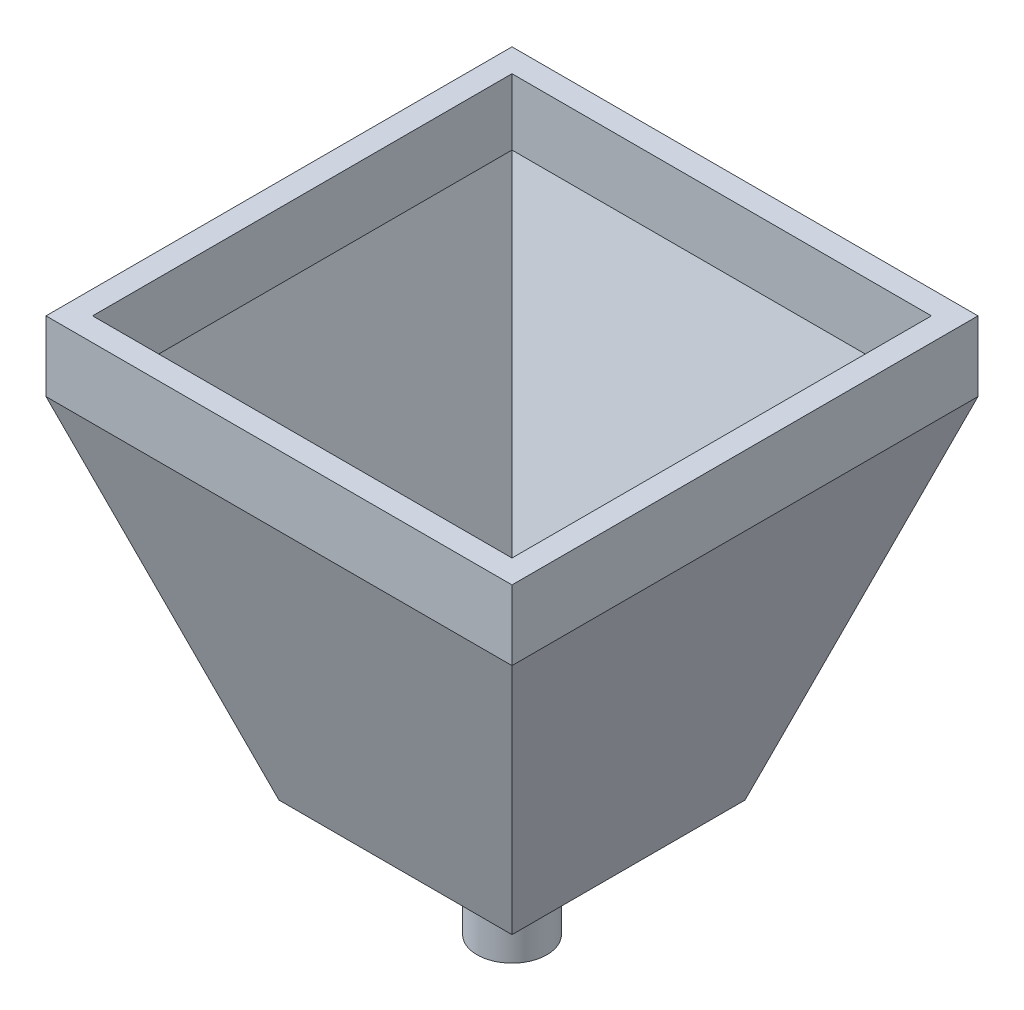
ISO-10303-21;
HEADER;
FILE_DESCRIPTION(('STEP AP214'),'2;1');
FILE_NAME('part.step','',(''),(''),'','','');
FILE_SCHEMA(('AUTOMOTIVE_DESIGN { 1 0 10303 214 1 1 1 1 }'));
ENDSEC;
DATA;
#1=APPLICATION_CONTEXT('core data for automotive mechanical design processes');
#2=APPLICATION_PROTOCOL_DEFINITION('international standard','automotive_design',2000,#1);
#3=PRODUCT_CONTEXT('',#1,'mechanical');
#4=PRODUCT('Part','Part','',(#3));
#5=PRODUCT_RELATED_PRODUCT_CATEGORY('part','',(#4));
#6=PRODUCT_DEFINITION_FORMATION('','',#4);
#7=PRODUCT_DEFINITION_CONTEXT('part definition',#1,'design');
#8=PRODUCT_DEFINITION('design','',#6,#7);
#9=PRODUCT_DEFINITION_SHAPE('','',#8);
#10=(LENGTH_UNIT() NAMED_UNIT(*) SI_UNIT(.MILLI.,.METRE.));
#11=(NAMED_UNIT(*) PLANE_ANGLE_UNIT() SI_UNIT($,.RADIAN.));
#12=(NAMED_UNIT(*) SI_UNIT($,.STERADIAN.) SOLID_ANGLE_UNIT());
#13=UNCERTAINTY_MEASURE_WITH_UNIT(LENGTH_MEASURE(1.E-05),#10,'distance_accuracy_value','');
#14=(GEOMETRIC_REPRESENTATION_CONTEXT(3) GLOBAL_UNCERTAINTY_ASSIGNED_CONTEXT((#13)) GLOBAL_UNIT_ASSIGNED_CONTEXT((#10,
#11,#12)) REPRESENTATION_CONTEXT('',''));
#15=CARTESIAN_POINT('',(0.,0.,0.));
#16=DIRECTION('',(0.,0.,1.));
#17=DIRECTION('',(1.,0.,0.));
#18=AXIS2_PLACEMENT_3D('',#15,#16,#17);
#19=CARTESIAN_POINT('',(0.,-5.,0.));
#20=DIRECTION('',(0.,1.,0.));
#21=DIRECTION('',(0.,0.,1.));
#22=AXIS2_PLACEMENT_3D('',#19,#20,#21);
#23=CYLINDRICAL_SURFACE('',#22,1.5);
#24=CARTESIAN_POINT('',(0.,-5.,0.));
#25=DIRECTION('',(0.,-1.,0.));
#26=DIRECTION('',(0.,0.,-1.));
#27=AXIS2_PLACEMENT_3D('',#24,#25,#26);
#28=CIRCLE('',#27,1.5);
#29=CARTESIAN_POINT('',(0.,-5.,-1.5));
#30=VERTEX_POINT('',#29);
#31=EDGE_CURVE('E13',#30,#30,#28,.T.);
#32=ORIENTED_EDGE('',*,*,#31,.F.);
#33=EDGE_LOOP('',(#32));
#34=FACE_BOUND('',#33,.T.);
#35=CARTESIAN_POINT('',(0.,0.,0.));
#36=DIRECTION('',(0.,-1.,0.));
#37=DIRECTION('',(0.,0.,-1.));
#38=AXIS2_PLACEMENT_3D('',#35,#36,#37);
#39=CIRCLE('',#38,1.5);
#40=CARTESIAN_POINT('',(0.,0.,-1.5));
#41=VERTEX_POINT('',#40);
#42=EDGE_CURVE('E62',#41,#41,#39,.T.);
#43=ORIENTED_EDGE('',*,*,#42,.T.);
#44=EDGE_LOOP('',(#43));
#45=FACE_BOUND('',#44,.T.);
#46=CARTESIAN_POINT('',(1.5,-1.43917780015329,0.));
#47=CARTESIAN_POINT('',(1.50000020822414,-1.43917752533704,0.0502423583340641));
#48=CARTESIAN_POINT('',(1.49745401376693,-1.44298478513104,0.100484543566457));
#49=CARTESIAN_POINT('',(1.48752326211906,-1.45797623220612,0.199366529015834));
#50=CARTESIAN_POINT('',(1.48013640790618,-1.46916392171494,0.248005556977501));
#51=CARTESIAN_POINT('',(1.46125241202354,-1.49823165881571,0.342106153927126));
#52=CARTESIAN_POINT('',(1.44977452746657,-1.51608037015726,0.387581436328778));
#53=CARTESIAN_POINT('',(1.4236306893872,-1.55770948178904,0.474707645498629));
#54=CARTESIAN_POINT('',(1.40896427302755,-1.58149074330357,0.516358015804834));
#55=CARTESIAN_POINT('',(1.37613664684919,-1.636506268837,0.598642350385054));
#56=CARTESIAN_POINT('',(1.3577844878966,-1.66820173052474,0.638890152730338));
#57=CARTESIAN_POINT('',(1.31991156541733,-1.73704282448251,0.713864022346369));
#58=CARTESIAN_POINT('',(1.30038915178416,-1.77419626507216,0.748582027719439));
#59=CARTESIAN_POINT('',(1.25864132339397,-1.85970398395962,0.81711148872748));
#60=CARTESIAN_POINT('',(1.23647533968899,-1.90890062675501,0.849915931813755));
#61=CARTESIAN_POINT('',(1.19542073676408,-2.01335948897656,0.906751785070868));
#62=CARTESIAN_POINT('',(1.17652647977327,-2.06861100093468,0.930798367132495));
#63=CARTESIAN_POINT('',(1.14988133320735,-2.16753344686409,0.963370175057203));
#64=CARTESIAN_POINT('',(1.14048813946218,-2.2099420265902,0.974372236180082));
#65=CARTESIAN_POINT('',(1.12628984829786,-2.29655005252416,0.9907530889261));
#66=CARTESIAN_POINT('',(1.12147684372013,-2.34074627451648,0.996141573259661));
#67=CARTESIAN_POINT('',(1.11718302804083,-2.42991518958136,1.00095682070629));
#68=CARTESIAN_POINT('',(1.11772401279478,-2.47489031187889,1.0003592145882));
#69=CARTESIAN_POINT('',(1.12409887741485,-2.56399528690377,0.993187906666195));
#70=CARTESIAN_POINT('',(1.12993724142592,-2.6081243911696,0.986609141899784));
#71=CARTESIAN_POINT('',(1.14563592995791,-2.69241132577208,0.968324971088712));
#72=CARTESIAN_POINT('',(1.15530744165153,-2.73265846811481,0.956858557405003));
#73=CARTESIAN_POINT('',(1.17754811463845,-2.81068964564904,0.929350592909502));
#74=CARTESIAN_POINT('',(1.19011822916388,-2.84847286530192,0.913307536614355));
#75=CARTESIAN_POINT('',(1.21982098202212,-2.92869049779443,0.873369093698319));
#76=CARTESIAN_POINT('',(1.23736158924507,-2.97050775024735,0.848540261643843));
#77=CARTESIAN_POINT('',(1.27345768922483,-3.04986949764519,0.793344802336529));
#78=CARTESIAN_POINT('',(1.29201441370947,-3.08740862899042,0.762971345040338));
#79=CARTESIAN_POINT('',(1.33271671862096,-3.16544907300885,0.689905826559711));
#80=CARTESIAN_POINT('',(1.35477372355024,-3.20484482450899,0.645969691404499));
#81=CARTESIAN_POINT('',(1.39609050337857,-3.27577604740822,0.55100399955381));
#82=CARTESIAN_POINT('',(1.41535288825285,-3.30731887285433,0.499981149675163));
#83=CARTESIAN_POINT('',(1.44572702044166,-3.35591665946749,0.402428913545601));
#84=CARTESIAN_POINT('',(1.45769630582498,-3.3745994818235,0.356978821685242));
#85=CARTESIAN_POINT('',(1.47753859515521,-3.40523026296523,0.263018021968455));
#86=CARTESIAN_POINT('',(1.48541506063844,-3.4171839137192,0.214509939501018));
#87=CARTESIAN_POINT('',(1.49637941078331,-3.43375838277248,0.115492726585947));
#88=CARTESIAN_POINT('',(1.49944661230576,-3.43834753062247,0.0649759059670237));
#89=CARTESIAN_POINT('',(1.50041557482591,-3.43980134443434,-0.0362207596946167));
#90=CARTESIAN_POINT('',(1.49831769692815,-3.43666655039768,-0.0869005930932817));
#91=CARTESIAN_POINT('',(1.48949794712138,-3.42336577237231,-0.183227858602147));
#92=CARTESIAN_POINT('',(1.48311123195135,-3.41370915127563,-0.228978722339655));
#93=CARTESIAN_POINT('',(1.46659224642396,-3.38837995714691,-0.31805819621364));
#94=CARTESIAN_POINT('',(1.45645937873408,-3.37270642468939,-0.361386418785355));
#95=CARTESIAN_POINT('',(1.4324817626467,-3.33485165163061,-0.447332375233221));
#96=CARTESIAN_POINT('',(1.41844935068245,-3.31233372311153,-0.489748092316564));
#97=CARTESIAN_POINT('',(1.38800927805403,-3.26196115518099,-0.57034151197779));
#98=CARTESIAN_POINT('',(1.37160015200652,-3.23410321989032,-0.608516574097255));
#99=CARTESIAN_POINT('',(1.33477273328243,-3.16887386607092,-0.685927227415323));
#100=CARTESIAN_POINT('',(1.31413078406203,-3.13069467010127,-0.724375937862665));
#101=CARTESIAN_POINT('',(1.27285586536854,-3.04862208518922,-0.794669840332393));
#102=CARTESIAN_POINT('',(1.25222291185946,-3.00472478065389,-0.826510468230433));
#103=CARTESIAN_POINT('',(1.21469839506517,-2.91560659372409,-0.880623882794763));
#104=CARTESIAN_POINT('',(1.19763798588662,-2.87081178325343,-0.903478180804394));
#105=CARTESIAN_POINT('',(1.16719487207113,-2.77724147376272,-0.942481068876251));
#106=CARTESIAN_POINT('',(1.1538055628277,-2.72847333095559,-0.958641728453858));
#107=CARTESIAN_POINT('',(1.13466604076532,-2.63689555658624,-0.981179217293119));
#108=CARTESIAN_POINT('',(1.12797499006895,-2.59459189522382,-0.988792987823092));
#109=CARTESIAN_POINT('',(1.11939733222928,-2.50889115948557,-0.998496029624887));
#110=CARTESIAN_POINT('',(1.11750550674066,-2.46549532458006,-1.00059130142516));
#111=CARTESIAN_POINT('',(1.11882100574833,-2.37885627179493,-0.999119609907757));
#112=CARTESIAN_POINT('',(1.12203134956834,-2.33561315947183,-0.995549293852656));
#113=CARTESIAN_POINT('',(1.1330522619864,-2.25050603588181,-0.982984986109971));
#114=CARTESIAN_POINT('',(1.14086896751217,-2.2086439432229,-0.97398375858765));
#115=CARTESIAN_POINT('',(1.1626342196827,-2.11632220693897,-0.947965178356308));
#116=CARTESIAN_POINT('',(1.17766166854602,-2.06654394378376,-0.929450935941994));
#117=CARTESIAN_POINT('',(1.21111080629161,-1.97143438306388,-0.885422631474874));
#118=CARTESIAN_POINT('',(1.22953724861882,-1.92610945118486,-0.859898741785421));
#119=CARTESIAN_POINT('',(1.26808593269726,-1.83953685655645,-0.801991402694657));
#120=CARTESIAN_POINT('',(1.28823293691071,-1.79837842743403,-0.769491549448272));
#121=CARTESIAN_POINT('',(1.32814150773993,-1.72151656103206,-0.698358840177309));
#122=CARTESIAN_POINT('',(1.3479029541764,-1.68581480164088,-0.659724105134951));
#123=CARTESIAN_POINT('',(1.38815775980392,-1.61582174799623,-0.570728664877768));
#124=CARTESIAN_POINT('',(1.40834902724558,-1.58246848006346,-0.519480834775987));
#125=CARTESIAN_POINT('',(1.44388832937518,-1.5252211618213,-0.410434277887489));
#126=CARTESIAN_POINT('',(1.45924396722731,-1.50131224674147,-0.352646031225022));
#127=CARTESIAN_POINT('',(1.48050822418367,-1.46860051107127,-0.245717534917525));
#128=CARTESIAN_POINT('',(1.48775740184446,-1.45762228060395,-0.197506162628867));
#129=CARTESIAN_POINT('',(1.49750140070948,-1.44291378388427,-0.0995290060120655));
#130=CARTESIAN_POINT('',(1.49999979375663,-1.43917807235529,-0.0497644180940288));
#131=CARTESIAN_POINT('',(1.5,-1.43917780015329,0.));
#132=B_SPLINE_CURVE_WITH_KNOTS('',3,(#46,#47,#48,#49,#50,#51,#52,#53,#54,#55,#56,#57,#58,#59,
#60,#61,#62,#63,#64,#65,#66,#67,#68,#69,#70,#71,#72,#73,#74,#75,#76,#77,#78,#79,#80,#81,#82,#83,
#84,#85,#86,#87,#88,#89,#90,#91,#92,#93,#94,#95,#96,#97,#98,#99,#100,#101,#102,#103,#104,#105,
#106,#107,#108,#109,#110,#111,#112,#113,#114,#115,#116,#117,#118,#119,#120,#121,#122,#123,#124,
#125,#126,#127,#128,#129,#130,#131),.UNSPECIFIED.,.T.,.F.,(4,2,2,2,2,2,2,2,2,2,2,2,2,2,2,2,2,2,
2,2,2,2,2,2,2,2,2,2,2,2,2,2,2,2,2,2,2,2,2,2,2,2,4),(0.,0.1505266132527,0.301124707174344,
0.451023076595116,0.600943219336932,0.763585145002784,0.926462058021593,1.11503341647991,
1.30327652722719,1.43716846838015,1.57082883922904,1.70503355867689,1.83935198631676,
1.96774431099011,2.09617891902539,2.25073787329797,2.40548851889212,2.5935947724756,
2.78152420149865,2.93262043847563,3.0835886757059,3.23520441646309,3.38680955765891,
3.5277654239542,3.66874377568319,3.81826173413942,3.96787227471786,4.1411408806983,
4.31452876587063,4.473249676497,4.63168313315305,4.76162024003011,4.8914160016149,
5.02128860137217,5.15133461921144,5.31603304346011,5.48096356682587,5.64889622595852,
5.81688041978686,6.00897675773024,6.20076953274023,6.34997645676982,6.49907115623394),.UNSPECIFIED.);
#133=CARTESIAN_POINT('',(1.5,-1.43917780015329,0.));
#134=VERTEX_POINT('',#133);
#135=CARTESIAN_POINT('',(1.5,-3.43917780015329,0.));
#136=VERTEX_POINT('',#135);
#137=EDGE_CURVE('E71',#134,#136,#132,.T.);
#138=ORIENTED_EDGE('',*,*,#137,.F.);
#139=EDGE_CURVE('E69',#136,#134,#132,.T.);
#140=ORIENTED_EDGE('',*,*,#139,.F.);
#141=EDGE_LOOP('',(#138,#140));
#142=FACE_BOUND('',#141,.T.);
#143=ADVANCED_FACE('F53',(#34,#45,#142),#23,.T.);
#144=CARTESIAN_POINT('',(0.,-5.,0.));
#145=DIRECTION('',(0.,-1.,0.));
#146=DIRECTION('',(0.,0.,-1.));
#147=AXIS2_PLACEMENT_3D('',#144,#145,#146);
#148=PLANE('',#147);
#149=CARTESIAN_POINT('',(0.,-5.,0.));
#150=DIRECTION('',(0.,-1.,0.));
#151=DIRECTION('',(0.,0.,-1.));
#152=AXIS2_PLACEMENT_3D('',#149,#150,#151);
#153=CIRCLE('',#152,1.40639171905491);
#154=CARTESIAN_POINT('',(0.,-5.,-1.40639171905491));
#155=VERTEX_POINT('',#154);
#156=EDGE_CURVE('E84',#155,#155,#153,.F.);
#157=ORIENTED_EDGE('',*,*,#156,.T.);
#158=EDGE_LOOP('',(#157));
#159=FACE_BOUND('',#158,.T.);
#160=ORIENTED_EDGE('',*,*,#31,.T.);
#161=EDGE_LOOP('',(#160));
#162=FACE_BOUND('',#161,.T.);
#163=ADVANCED_FACE('F96',(#159,#162),#148,.T.);
#164=CARTESIAN_POINT('',(0.,0.,0.));
#165=DIRECTION('',(0.,-1.,0.));
#166=DIRECTION('',(0.,0.,-1.));
#167=AXIS2_PLACEMENT_3D('',#164,#165,#166);
#168=PLANE('',#167);
#169=CARTESIAN_POINT('',(0.,0.,0.));
#170=DIRECTION('',(0.,-1.,0.));
#171=DIRECTION('',(0.,0.,-1.));
#172=AXIS2_PLACEMENT_3D('',#169,#170,#171);
#173=CIRCLE('',#172,1.40639171905491);
#174=CARTESIAN_POINT('',(0.,0.,-1.40639171905491));
#175=VERTEX_POINT('',#174);
#176=EDGE_CURVE('E57',#175,#175,#173,.F.);
#177=ORIENTED_EDGE('',*,*,#176,.F.);
#178=EDGE_LOOP('',(#177));
#179=FACE_BOUND('',#178,.T.);
#180=ORIENTED_EDGE('',*,*,#42,.F.);
#181=EDGE_LOOP('',(#180));
#182=FACE_BOUND('',#181,.T.);
#183=ADVANCED_FACE('F98',(#179,#182),#168,.F.);
#184=CARTESIAN_POINT('',(1.5,-2.43917780015329,0.));
#185=DIRECTION('',(1.,0.,0.));
#186=DIRECTION('',(0.,0.,-1.));
#187=AXIS2_PLACEMENT_3D('',#184,#185,#186);
#188=PLANE('',#187);
#189=CARTESIAN_POINT('',(1.5,-2.43917780015329,0.));
#190=DIRECTION('',(1.,0.,0.));
#191=DIRECTION('',(0.,0.,-1.));
#192=AXIS2_PLACEMENT_3D('',#189,#190,#191);
#193=CIRCLE('',#192,1.);
#194=EDGE_CURVE('E79',#136,#134,#193,.T.);
#195=ORIENTED_EDGE('',*,*,#194,.T.);
#196=EDGE_CURVE('E81',#134,#136,#193,.T.);
#197=ORIENTED_EDGE('',*,*,#196,.T.);
#198=EDGE_LOOP('',(#195,#197));
#199=FACE_BOUND('',#198,.T.);
#200=ADVANCED_FACE('F83',(#199),#188,.T.);
#201=CARTESIAN_POINT('',(1.5,-2.43917780015329,0.));
#202=DIRECTION('',(-1.,0.,0.));
#203=DIRECTION('',(0.,0.,1.));
#204=AXIS2_PLACEMENT_3D('',#201,#202,#203);
#205=CYLINDRICAL_SURFACE('',#204,1.);
#206=ORIENTED_EDGE('',*,*,#196,.F.);
#207=ORIENTED_EDGE('',*,*,#137,.T.);
#208=EDGE_LOOP('',(#206,#207));
#209=FACE_BOUND('',#208,.T.);
#210=ADVANCED_FACE('F86',(#209),#205,.T.);
#211=ORIENTED_EDGE('',*,*,#194,.F.);
#212=ORIENTED_EDGE('',*,*,#139,.T.);
#213=EDGE_LOOP('',(#211,#212));
#214=FACE_BOUND('',#213,.T.);
#215=ADVANCED_FACE('F78',(#214),#205,.T.);
#216=CARTESIAN_POINT('',(0.,-31.5,0.));
#217=DIRECTION('',(0.,1.,0.));
#218=DIRECTION('',(0.,0.,1.));
#219=AXIS2_PLACEMENT_3D('',#216,#217,#218);
#220=CYLINDRICAL_SURFACE('',#219,1.40639171905491);
#221=ORIENTED_EDGE('',*,*,#156,.F.);
#222=EDGE_LOOP('',(#221));
#223=FACE_BOUND('',#222,.T.);
#224=ORIENTED_EDGE('',*,*,#176,.T.);
#225=EDGE_LOOP('',(#224));
#226=FACE_BOUND('',#225,.T.);
#227=ADVANCED_FACE('F135',(#223,#226),#220,.F.);
#228=CLOSED_SHELL('',(#143,#163,#183,#200,#210,#215,#227));
#229=MANIFOLD_SOLID_BREP('B2',#228);
#230=CARTESIAN_POINT('',(0.,0.,0.));
#231=DIRECTION('',(0.,-1.,0.));
#232=DIRECTION('',(0.,0.,-1.));
#233=AXIS2_PLACEMENT_3D('',#230,#231,#232);
#234=PLANE('',#233);
#235=CARTESIAN_POINT('',(0.,0.,0.));
#236=DIRECTION('',(0.,-1.,0.));
#237=DIRECTION('',(0.,0.,-1.));
#238=AXIS2_PLACEMENT_3D('',#235,#236,#237);
#239=CIRCLE('',#238,1.5);
#240=CARTESIAN_POINT('',(0.,0.,-1.5));
#241=VERTEX_POINT('',#240);
#242=EDGE_CURVE('E621',#241,#241,#239,.T.);
#243=ORIENTED_EDGE('',*,*,#242,.F.);
#244=EDGE_LOOP('',(#243));
#245=FACE_BOUND('',#244,.T.);
#246=DIRECTION('',(0.,0.,-1.));
#247=VECTOR('',#246,1.);
#248=CARTESIAN_POINT('',(5.,0.,5.));
#249=LINE('',#248,#247);
#250=CARTESIAN_POINT('',(5.,0.,5.));
#251=VERTEX_POINT('',#250);
#252=CARTESIAN_POINT('',(5.,0.,-5.));
#253=VERTEX_POINT('',#252);
#254=EDGE_CURVE('E394',#251,#253,#249,.T.);
#255=ORIENTED_EDGE('',*,*,#254,.F.);
#256=DIRECTION('',(1.,0.,0.));
#257=VECTOR('',#256,1.);
#258=CARTESIAN_POINT('',(-5.,0.,5.));
#259=LINE('',#258,#257);
#260=CARTESIAN_POINT('',(-5.,0.,5.));
#261=VERTEX_POINT('',#260);
#262=EDGE_CURVE('E51',#261,#251,#259,.T.);
#263=ORIENTED_EDGE('',*,*,#262,.F.);
#264=DIRECTION('',(0.,0.,1.));
#265=VECTOR('',#264,1.);
#266=CARTESIAN_POINT('',(-5.,0.,5.));
#267=LINE('',#266,#265);
#268=CARTESIAN_POINT('',(-5.,0.,-5.));
#269=VERTEX_POINT('',#268);
#270=EDGE_CURVE('E174',#269,#261,#267,.T.);
#271=ORIENTED_EDGE('',*,*,#270,.F.);
#272=DIRECTION('',(-1.,0.,0.));
#273=VECTOR('',#272,1.);
#274=CARTESIAN_POINT('',(-5.,0.,-5.));
#275=LINE('',#274,#273);
#276=EDGE_CURVE('E382',#253,#269,#275,.T.);
#277=ORIENTED_EDGE('',*,*,#276,.F.);
#278=EDGE_LOOP('',(#255,#263,#271,#277));
#279=FACE_BOUND('',#278,.T.);
#280=ADVANCED_FACE('F165',(#245,#279),#234,.T.);
#281=CARTESIAN_POINT('',(-4.5,-1.5,0.));
#282=DIRECTION('',(-0.948683298050514,-0.316227766016838,0.));
#283=DIRECTION('',(0.316227766016838,-0.948683298050514,0.));
#284=AXIS2_PLACEMENT_3D('',#281,#282,#283);
#285=PLANE('',#284);
#286=DIRECTION('',(0.301511344577764,-0.904534033733291,0.301511344577763));
#287=VECTOR('',#286,1.);
#288=CARTESIAN_POINT('',(-10.,15.,-10.));
#289=LINE('',#288,#287);
#290=CARTESIAN_POINT('',(-10.,15.,-10.));
#291=VERTEX_POINT('',#290);
#292=EDGE_CURVE('E438',#291,#269,#289,.T.);
#293=ORIENTED_EDGE('',*,*,#292,.T.);
#294=ORIENTED_EDGE('',*,*,#270,.T.);
#295=DIRECTION('',(0.301511344577764,-0.904534033733291,-0.301511344577764));
#296=VECTOR('',#295,1.);
#297=CARTESIAN_POINT('',(-10.,15.,10.));
#298=LINE('',#297,#296);
#299=CARTESIAN_POINT('',(-10.,15.,10.));
#300=VERTEX_POINT('',#299);
#301=EDGE_CURVE('E336',#300,#261,#298,.T.);
#302=ORIENTED_EDGE('',*,*,#301,.F.);
#303=DIRECTION('',(0.,0.,1.));
#304=VECTOR('',#303,1.);
#305=CARTESIAN_POINT('',(-10.,15.,10.));
#306=LINE('',#305,#304);
#307=EDGE_CURVE('E450',#291,#300,#306,.T.);
#308=ORIENTED_EDGE('',*,*,#307,.F.);
#309=EDGE_LOOP('',(#293,#294,#302,#308));
#310=FACE_BOUND('',#309,.T.);
#311=ADVANCED_FACE('F349',(#310),#285,.T.);
#312=CARTESIAN_POINT('',(0.,-1.5,4.5));
#313=DIRECTION('',(0.,-0.316227766016838,0.948683298050514));
#314=DIRECTION('',(0.,-0.948683298050514,-0.316227766016838));
#315=AXIS2_PLACEMENT_3D('',#312,#313,#314);
#316=PLANE('',#315);
#317=ORIENTED_EDGE('',*,*,#301,.T.);
#318=ORIENTED_EDGE('',*,*,#262,.T.);
#319=DIRECTION('',(-0.301511344577763,-0.904534033733291,-0.301511344577764));
#320=VECTOR('',#319,1.);
#321=CARTESIAN_POINT('',(10.,15.,10.));
#322=LINE('',#321,#320);
#323=CARTESIAN_POINT('',(10.,15.,10.));
#324=VERTEX_POINT('',#323);
#325=EDGE_CURVE('E190',#324,#251,#322,.T.);
#326=ORIENTED_EDGE('',*,*,#325,.F.);
#327=DIRECTION('',(1.,0.,0.));
#328=VECTOR('',#327,1.);
#329=CARTESIAN_POINT('',(-10.,15.,10.));
#330=LINE('',#329,#328);
#331=EDGE_CURVE('E330',#300,#324,#330,.T.);
#332=ORIENTED_EDGE('',*,*,#331,.F.);
#333=EDGE_LOOP('',(#317,#318,#326,#332));
#334=FACE_BOUND('',#333,.T.);
#335=ADVANCED_FACE('F338',(#334),#316,.T.);
#336=CARTESIAN_POINT('',(0.,-1.5,-4.5));
#337=DIRECTION('',(0.,-0.316227766016838,-0.948683298050514));
#338=DIRECTION('',(0.,0.948683298050514,-0.316227766016838));
#339=AXIS2_PLACEMENT_3D('',#336,#337,#338);
#340=PLANE('',#339);
#341=DIRECTION('',(-0.301511344577763,-0.904534033733291,0.301511344577764));
#342=VECTOR('',#341,1.);
#343=CARTESIAN_POINT('',(10.,15.,-10.));
#344=LINE('',#343,#342);
#345=CARTESIAN_POINT('',(10.,15.,-10.));
#346=VERTEX_POINT('',#345);
#347=EDGE_CURVE('E423',#346,#253,#344,.T.);
#348=ORIENTED_EDGE('',*,*,#347,.T.);
#349=ORIENTED_EDGE('',*,*,#276,.T.);
#350=ORIENTED_EDGE('',*,*,#292,.F.);
#351=DIRECTION('',(-1.,0.,0.));
#352=VECTOR('',#351,1.);
#353=CARTESIAN_POINT('',(-10.,15.,-10.));
#354=LINE('',#353,#352);
#355=EDGE_CURVE('E435',#346,#291,#354,.T.);
#356=ORIENTED_EDGE('',*,*,#355,.F.);
#357=EDGE_LOOP('',(#348,#349,#350,#356));
#358=FACE_BOUND('',#357,.T.);
#359=ADVANCED_FACE('F348',(#358),#340,.T.);
#360=CARTESIAN_POINT('',(4.5,-1.5,0.));
#361=DIRECTION('',(0.948683298050514,-0.316227766016838,0.));
#362=DIRECTION('',(0.316227766016838,0.948683298050514,0.));
#363=AXIS2_PLACEMENT_3D('',#360,#361,#362);
#364=PLANE('',#363);
#365=ORIENTED_EDGE('',*,*,#325,.T.);
#366=ORIENTED_EDGE('',*,*,#254,.T.);
#367=ORIENTED_EDGE('',*,*,#347,.F.);
#368=DIRECTION('',(0.,0.,-1.));
#369=VECTOR('',#368,1.);
#370=CARTESIAN_POINT('',(10.,15.,10.));
#371=LINE('',#370,#369);
#372=EDGE_CURVE('E420',#324,#346,#371,.T.);
#373=ORIENTED_EDGE('',*,*,#372,.F.);
#374=EDGE_LOOP('',(#365,#366,#367,#373));
#375=FACE_BOUND('',#374,.T.);
#376=ADVANCED_FACE('F400',(#375),#364,.T.);
#377=CARTESIAN_POINT('',(-10.,18.,10.));
#378=DIRECTION('',(1.,0.,0.));
#379=DIRECTION('',(0.,0.,-1.));
#380=AXIS2_PLACEMENT_3D('',#377,#378,#379);
#381=PLANE('',#380);
#382=ORIENTED_EDGE('',*,*,#307,.T.);
#383=DIRECTION('',(0.,-1.,0.));
#384=VECTOR('',#383,1.);
#385=CARTESIAN_POINT('',(-10.,18.,10.));
#386=LINE('',#385,#384);
#387=CARTESIAN_POINT('',(-10.,18.,10.));
#388=VERTEX_POINT('',#387);
#389=EDGE_CURVE('E500',#388,#300,#386,.T.);
#390=ORIENTED_EDGE('',*,*,#389,.F.);
#391=DIRECTION('',(0.,0.,1.));
#392=VECTOR('',#391,1.);
#393=CARTESIAN_POINT('',(-10.,18.,10.));
#394=LINE('',#393,#392);
#395=CARTESIAN_POINT('',(-10.,18.,-10.));
#396=VERTEX_POINT('',#395);
#397=EDGE_CURVE('E266',#396,#388,#394,.T.);
#398=ORIENTED_EDGE('',*,*,#397,.F.);
#399=DIRECTION('',(0.,-1.,0.));
#400=VECTOR('',#399,1.);
#401=CARTESIAN_POINT('',(-10.,18.,-10.));
#402=LINE('',#401,#400);
#403=EDGE_CURVE('E324',#396,#291,#402,.T.);
#404=ORIENTED_EDGE('',*,*,#403,.T.);
#405=EDGE_LOOP('',(#382,#390,#398,#404));
#406=FACE_BOUND('',#405,.T.);
#407=ADVANCED_FACE('F408',(#406),#381,.F.);
#408=CARTESIAN_POINT('',(10.,18.,10.));
#409=DIRECTION('',(0.,0.,-1.));
#410=DIRECTION('',(-1.,0.,0.));
#411=AXIS2_PLACEMENT_3D('',#408,#409,#410);
#412=PLANE('',#411);
#413=ORIENTED_EDGE('',*,*,#331,.T.);
#414=DIRECTION('',(0.,-1.,0.));
#415=VECTOR('',#414,1.);
#416=CARTESIAN_POINT('',(10.,18.,10.));
#417=LINE('',#416,#415);
#418=CARTESIAN_POINT('',(10.,18.,10.));
#419=VERTEX_POINT('',#418);
#420=EDGE_CURVE('E492',#419,#324,#417,.T.);
#421=ORIENTED_EDGE('',*,*,#420,.F.);
#422=DIRECTION('',(1.,0.,0.));
#423=VECTOR('',#422,1.);
#424=CARTESIAN_POINT('',(10.,18.,10.));
#425=LINE('',#424,#423);
#426=EDGE_CURVE('E318',#388,#419,#425,.T.);
#427=ORIENTED_EDGE('',*,*,#426,.F.);
#428=ORIENTED_EDGE('',*,*,#389,.T.);
#429=EDGE_LOOP('',(#413,#421,#427,#428));
#430=FACE_BOUND('',#429,.T.);
#431=ADVANCED_FACE('F512',(#430),#412,.F.);
#432=CARTESIAN_POINT('',(10.,18.,10.));
#433=DIRECTION('',(-1.,0.,0.));
#434=DIRECTION('',(0.,0.,1.));
#435=AXIS2_PLACEMENT_3D('',#432,#433,#434);
#436=PLANE('',#435);
#437=ORIENTED_EDGE('',*,*,#372,.T.);
#438=DIRECTION('',(0.,-1.,0.));
#439=VECTOR('',#438,1.);
#440=CARTESIAN_POINT('',(10.,18.,-10.));
#441=LINE('',#440,#439);
#442=CARTESIAN_POINT('',(10.,18.,-10.));
#443=VERTEX_POINT('',#442);
#444=EDGE_CURVE('E501',#443,#346,#441,.T.);
#445=ORIENTED_EDGE('',*,*,#444,.F.);
#446=DIRECTION('',(0.,0.,-1.));
#447=VECTOR('',#446,1.);
#448=CARTESIAN_POINT('',(10.,18.,10.));
#449=LINE('',#448,#447);
#450=EDGE_CURVE('E320',#419,#443,#449,.T.);
#451=ORIENTED_EDGE('',*,*,#450,.F.);
#452=ORIENTED_EDGE('',*,*,#420,.T.);
#453=EDGE_LOOP('',(#437,#445,#451,#452));
#454=FACE_BOUND('',#453,.T.);
#455=ADVANCED_FACE('F521',(#454),#436,.F.);
#456=CARTESIAN_POINT('',(10.,18.,-10.));
#457=DIRECTION('',(0.,0.,1.));
#458=DIRECTION('',(1.,0.,0.));
#459=AXIS2_PLACEMENT_3D('',#456,#457,#458);
#460=PLANE('',#459);
#461=ORIENTED_EDGE('',*,*,#355,.T.);
#462=ORIENTED_EDGE('',*,*,#403,.F.);
#463=DIRECTION('',(-1.,0.,0.));
#464=VECTOR('',#463,1.);
#465=CARTESIAN_POINT('',(10.,18.,-10.));
#466=LINE('',#465,#464);
#467=EDGE_CURVE('E322',#443,#396,#466,.T.);
#468=ORIENTED_EDGE('',*,*,#467,.F.);
#469=ORIENTED_EDGE('',*,*,#444,.T.);
#470=EDGE_LOOP('',(#461,#462,#468,#469));
#471=FACE_BOUND('',#470,.T.);
#472=ADVANCED_FACE('F564',(#471),#460,.F.);
#473=CARTESIAN_POINT('',(0.,18.,0.));
#474=DIRECTION('',(0.,1.,0.));
#475=DIRECTION('',(0.,0.,1.));
#476=AXIS2_PLACEMENT_3D('',#473,#474,#475);
#477=PLANE('',#476);
#478=DIRECTION('',(0.,0.,1.));
#479=VECTOR('',#478,1.);
#480=CARTESIAN_POINT('',(-9.,18.,10.));
#481=LINE('',#480,#479);
#482=CARTESIAN_POINT('',(-9.,18.,-9.));
#483=VERTEX_POINT('',#482);
#484=CARTESIAN_POINT('',(-9.,18.,9.));
#485=VERTEX_POINT('',#484);
#486=EDGE_CURVE('E309',#483,#485,#481,.T.);
#487=ORIENTED_EDGE('',*,*,#486,.F.);
#488=DIRECTION('',(-1.,0.,0.));
#489=VECTOR('',#488,1.);
#490=CARTESIAN_POINT('',(10.,18.,-9.));
#491=LINE('',#490,#489);
#492=CARTESIAN_POINT('',(9.,18.,-9.));
#493=VERTEX_POINT('',#492);
#494=EDGE_CURVE('E305',#493,#483,#491,.T.);
#495=ORIENTED_EDGE('',*,*,#494,.F.);
#496=DIRECTION('',(0.,0.,-1.));
#497=VECTOR('',#496,1.);
#498=CARTESIAN_POINT('',(9.,18.,10.));
#499=LINE('',#498,#497);
#500=CARTESIAN_POINT('',(9.,18.,9.));
#501=VERTEX_POINT('',#500);
#502=EDGE_CURVE('E313',#501,#493,#499,.T.);
#503=ORIENTED_EDGE('',*,*,#502,.F.);
#504=DIRECTION('',(1.,0.,0.));
#505=VECTOR('',#504,1.);
#506=CARTESIAN_POINT('',(10.,18.,9.));
#507=LINE('',#506,#505);
#508=EDGE_CURVE('E311',#485,#501,#507,.T.);
#509=ORIENTED_EDGE('',*,*,#508,.F.);
#510=EDGE_LOOP('',(#487,#495,#503,#509));
#511=FACE_BOUND('',#510,.T.);
#512=ORIENTED_EDGE('',*,*,#397,.T.);
#513=ORIENTED_EDGE('',*,*,#426,.T.);
#514=ORIENTED_EDGE('',*,*,#450,.T.);
#515=ORIENTED_EDGE('',*,*,#467,.T.);
#516=EDGE_LOOP('',(#512,#513,#514,#515));
#517=FACE_BOUND('',#516,.T.);
#518=ADVANCED_FACE('F573',(#511,#517),#477,.T.);
#519=CARTESIAN_POINT('',(0.,1.,0.));
#520=DIRECTION('',(0.,-1.,0.));
#521=DIRECTION('',(0.,0.,-1.));
#522=AXIS2_PLACEMENT_3D('',#519,#520,#521);
#523=PLANE('',#522);
#524=CARTESIAN_POINT('',(0.,1.,0.));
#525=DIRECTION('',(0.,-1.,0.));
#526=DIRECTION('',(0.,0.,-1.));
#527=AXIS2_PLACEMENT_3D('',#524,#525,#526);
#528=CIRCLE('',#527,1.5);
#529=CARTESIAN_POINT('',(0.,1.,-1.5));
#530=VERTEX_POINT('',#529);
#531=EDGE_CURVE('E169',#530,#530,#528,.T.);
#532=ORIENTED_EDGE('',*,*,#531,.T.);
#533=EDGE_LOOP('',(#532));
#534=FACE_BOUND('',#533,.T.);
#535=DIRECTION('',(0.,0.,-1.));
#536=VECTOR('',#535,1.);
#537=CARTESIAN_POINT('',(4.27924077994388,1.,0.));
#538=LINE('',#537,#536);
#539=CARTESIAN_POINT('',(4.27924077994388,1.,4.27924077994387));
#540=VERTEX_POINT('',#539);
#541=CARTESIAN_POINT('',(4.27924077994388,1.,-4.27924077994387));
#542=VERTEX_POINT('',#541);
#543=EDGE_CURVE('E291',#540,#542,#538,.T.);
#544=ORIENTED_EDGE('',*,*,#543,.T.);
#545=DIRECTION('',(-1.,0.,0.));
#546=VECTOR('',#545,1.);
#547=CARTESIAN_POINT('',(0.,1.,-4.27924077994387));
#548=LINE('',#547,#546);
#549=CARTESIAN_POINT('',(-4.27924077994387,1.,-4.27924077994387));
#550=VERTEX_POINT('',#549);
#551=EDGE_CURVE('E271',#542,#550,#548,.T.);
#552=ORIENTED_EDGE('',*,*,#551,.T.);
#553=DIRECTION('',(0.,0.,1.));
#554=VECTOR('',#553,1.);
#555=CARTESIAN_POINT('',(-4.27924077994387,1.,0.));
#556=LINE('',#555,#554);
#557=CARTESIAN_POINT('',(-4.27924077994387,1.,4.27924077994387));
#558=VERTEX_POINT('',#557);
#559=EDGE_CURVE('E267',#550,#558,#556,.T.);
#560=ORIENTED_EDGE('',*,*,#559,.T.);
#561=DIRECTION('',(1.,0.,0.));
#562=VECTOR('',#561,1.);
#563=CARTESIAN_POINT('',(0.,1.,4.27924077994387));
#564=LINE('',#563,#562);
#565=EDGE_CURVE('E255',#558,#540,#564,.T.);
#566=ORIENTED_EDGE('',*,*,#565,.T.);
#567=EDGE_LOOP('',(#544,#552,#560,#566));
#568=FACE_BOUND('',#567,.T.);
#569=ADVANCED_FACE('F270',(#534,#568),#523,.F.);
#570=CARTESIAN_POINT('',(-3.55131670194948,-1.18377223398316,0.));
#571=DIRECTION('',(-0.948683298050514,-0.316227766016838,0.));
#572=DIRECTION('',(0.316227766016838,-0.948683298050514,0.));
#573=AXIS2_PLACEMENT_3D('',#570,#571,#572);
#574=PLANE('',#573);
#575=DIRECTION('',(0.301511344577764,-0.904534033733291,0.301511344577763));
#576=VECTOR('',#575,1.);
#577=CARTESIAN_POINT('',(-3.22846972904498,-2.15231315269666,-3.22846972904499));
#578=LINE('',#577,#576);
#579=CARTESIAN_POINT('',(-9.,15.1622776601684,-9.));
#580=VERTEX_POINT('',#579);
#581=EDGE_CURVE('E280',#580,#550,#578,.T.);
#582=ORIENTED_EDGE('',*,*,#581,.F.);
#583=DIRECTION('',(0.,0.,1.));
#584=VECTOR('',#583,1.);
#585=CARTESIAN_POINT('',(-9.,15.1622776601684,0.));
#586=LINE('',#585,#584);
#587=CARTESIAN_POINT('',(-9.,15.1622776601684,9.));
#588=VERTEX_POINT('',#587);
#589=EDGE_CURVE('E278',#580,#588,#586,.T.);
#590=ORIENTED_EDGE('',*,*,#589,.T.);
#591=DIRECTION('',(0.301511344577764,-0.904534033733291,-0.301511344577764));
#592=VECTOR('',#591,1.);
#593=CARTESIAN_POINT('',(-3.22846972904498,-2.15231315269666,3.22846972904498));
#594=LINE('',#593,#592);
#595=EDGE_CURVE('E260',#588,#558,#594,.T.);
#596=ORIENTED_EDGE('',*,*,#595,.T.);
#597=ORIENTED_EDGE('',*,*,#559,.F.);
#598=EDGE_LOOP('',(#582,#590,#596,#597));
#599=FACE_BOUND('',#598,.T.);
#600=ADVANCED_FACE('F277',(#599),#574,.F.);
#601=CARTESIAN_POINT('',(0.,-1.18377223398316,3.55131670194948));
#602=DIRECTION('',(0.,-0.316227766016838,0.948683298050514));
#603=DIRECTION('',(0.,-0.948683298050514,-0.316227766016838));
#604=AXIS2_PLACEMENT_3D('',#601,#602,#603);
#605=PLANE('',#604);
#606=ORIENTED_EDGE('',*,*,#595,.F.);
#607=DIRECTION('',(1.,0.,0.));
#608=VECTOR('',#607,1.);
#609=CARTESIAN_POINT('',(0.,15.1622776601684,9.));
#610=LINE('',#609,#608);
#611=CARTESIAN_POINT('',(9.,15.1622776601684,9.));
#612=VERTEX_POINT('',#611);
#613=EDGE_CURVE('E284',#588,#612,#610,.T.);
#614=ORIENTED_EDGE('',*,*,#613,.T.);
#615=DIRECTION('',(-0.301511344577763,-0.904534033733291,-0.301511344577764));
#616=VECTOR('',#615,1.);
#617=CARTESIAN_POINT('',(3.22846972904499,-2.15231315269666,3.22846972904498));
#618=LINE('',#617,#616);
#619=EDGE_CURVE('E262',#612,#540,#618,.T.);
#620=ORIENTED_EDGE('',*,*,#619,.T.);
#621=ORIENTED_EDGE('',*,*,#565,.F.);
#622=EDGE_LOOP('',(#606,#614,#620,#621));
#623=FACE_BOUND('',#622,.T.);
#624=ADVANCED_FACE('F257',(#623),#605,.F.);
#625=CARTESIAN_POINT('',(0.,-1.18377223398316,-3.55131670194949));
#626=DIRECTION('',(0.,-0.316227766016838,-0.948683298050514));
#627=DIRECTION('',(0.,0.948683298050514,-0.316227766016838));
#628=AXIS2_PLACEMENT_3D('',#625,#626,#627);
#629=PLANE('',#628);
#630=DIRECTION('',(-0.301511344577763,-0.904534033733291,0.301511344577764));
#631=VECTOR('',#630,1.);
#632=CARTESIAN_POINT('',(3.22846972904499,-2.15231315269666,-3.22846972904499));
#633=LINE('',#632,#631);
#634=CARTESIAN_POINT('',(9.,15.1622776601684,-9.));
#635=VERTEX_POINT('',#634);
#636=EDGE_CURVE('E279',#635,#542,#633,.T.);
#637=ORIENTED_EDGE('',*,*,#636,.F.);
#638=DIRECTION('',(-1.,0.,0.));
#639=VECTOR('',#638,1.);
#640=CARTESIAN_POINT('',(0.,15.1622776601684,-9.));
#641=LINE('',#640,#639);
#642=EDGE_CURVE('E289',#635,#580,#641,.T.);
#643=ORIENTED_EDGE('',*,*,#642,.T.);
#644=ORIENTED_EDGE('',*,*,#581,.T.);
#645=ORIENTED_EDGE('',*,*,#551,.F.);
#646=EDGE_LOOP('',(#637,#643,#644,#645));
#647=FACE_BOUND('',#646,.T.);
#648=ADVANCED_FACE('F597',(#647),#629,.F.);
#649=CARTESIAN_POINT('',(3.55131670194949,-1.18377223398316,0.));
#650=DIRECTION('',(0.948683298050514,-0.316227766016838,0.));
#651=DIRECTION('',(0.316227766016838,0.948683298050514,0.));
#652=AXIS2_PLACEMENT_3D('',#649,#650,#651);
#653=PLANE('',#652);
#654=ORIENTED_EDGE('',*,*,#619,.F.);
#655=DIRECTION('',(0.,0.,-1.));
#656=VECTOR('',#655,1.);
#657=CARTESIAN_POINT('',(9.,15.1622776601684,0.));
#658=LINE('',#657,#656);
#659=EDGE_CURVE('E293',#612,#635,#658,.T.);
#660=ORIENTED_EDGE('',*,*,#659,.T.);
#661=ORIENTED_EDGE('',*,*,#636,.T.);
#662=ORIENTED_EDGE('',*,*,#543,.F.);
#663=EDGE_LOOP('',(#654,#660,#661,#662));
#664=FACE_BOUND('',#663,.T.);
#665=ADVANCED_FACE('F593',(#664),#653,.F.);
#666=CARTESIAN_POINT('',(-9.,18.,10.));
#667=DIRECTION('',(1.,0.,0.));
#668=DIRECTION('',(0.,0.,-1.));
#669=AXIS2_PLACEMENT_3D('',#666,#667,#668);
#670=PLANE('',#669);
#671=ORIENTED_EDGE('',*,*,#589,.F.);
#672=DIRECTION('',(0.,-1.,0.));
#673=VECTOR('',#672,1.);
#674=CARTESIAN_POINT('',(-9.,18.,-9.));
#675=LINE('',#674,#673);
#676=EDGE_CURVE('E302',#483,#580,#675,.T.);
#677=ORIENTED_EDGE('',*,*,#676,.F.);
#678=ORIENTED_EDGE('',*,*,#486,.T.);
#679=DIRECTION('',(0.,-1.,0.));
#680=VECTOR('',#679,1.);
#681=CARTESIAN_POINT('',(-9.,18.,9.));
#682=LINE('',#681,#680);
#683=EDGE_CURVE('E296',#485,#588,#682,.T.);
#684=ORIENTED_EDGE('',*,*,#683,.T.);
#685=EDGE_LOOP('',(#671,#677,#678,#684));
#686=FACE_BOUND('',#685,.T.);
#687=ADVANCED_FACE('F589',(#686),#670,.T.);
#688=CARTESIAN_POINT('',(10.,18.,9.));
#689=DIRECTION('',(0.,0.,-1.));
#690=DIRECTION('',(-1.,0.,0.));
#691=AXIS2_PLACEMENT_3D('',#688,#689,#690);
#692=PLANE('',#691);
#693=ORIENTED_EDGE('',*,*,#613,.F.);
#694=ORIENTED_EDGE('',*,*,#683,.F.);
#695=ORIENTED_EDGE('',*,*,#508,.T.);
#696=DIRECTION('',(0.,-1.,0.));
#697=VECTOR('',#696,1.);
#698=CARTESIAN_POINT('',(9.,18.,9.));
#699=LINE('',#698,#697);
#700=EDGE_CURVE('E301',#501,#612,#699,.T.);
#701=ORIENTED_EDGE('',*,*,#700,.T.);
#702=EDGE_LOOP('',(#693,#694,#695,#701));
#703=FACE_BOUND('',#702,.T.);
#704=ADVANCED_FACE('F585',(#703),#692,.T.);
#705=CARTESIAN_POINT('',(9.,18.,10.));
#706=DIRECTION('',(-1.,0.,0.));
#707=DIRECTION('',(0.,0.,1.));
#708=AXIS2_PLACEMENT_3D('',#705,#706,#707);
#709=PLANE('',#708);
#710=ORIENTED_EDGE('',*,*,#659,.F.);
#711=ORIENTED_EDGE('',*,*,#700,.F.);
#712=ORIENTED_EDGE('',*,*,#502,.T.);
#713=DIRECTION('',(0.,-1.,0.));
#714=VECTOR('',#713,1.);
#715=CARTESIAN_POINT('',(9.,18.,-9.));
#716=LINE('',#715,#714);
#717=EDGE_CURVE('E182',#493,#635,#716,.T.);
#718=ORIENTED_EDGE('',*,*,#717,.T.);
#719=EDGE_LOOP('',(#710,#711,#712,#718));
#720=FACE_BOUND('',#719,.T.);
#721=ADVANCED_FACE('F582',(#720),#709,.T.);
#722=CARTESIAN_POINT('',(10.,18.,-9.));
#723=DIRECTION('',(0.,0.,1.));
#724=DIRECTION('',(1.,0.,0.));
#725=AXIS2_PLACEMENT_3D('',#722,#723,#724);
#726=PLANE('',#725);
#727=ORIENTED_EDGE('',*,*,#642,.F.);
#728=ORIENTED_EDGE('',*,*,#717,.F.);
#729=ORIENTED_EDGE('',*,*,#494,.T.);
#730=ORIENTED_EDGE('',*,*,#676,.T.);
#731=EDGE_LOOP('',(#727,#728,#729,#730));
#732=FACE_BOUND('',#731,.T.);
#733=ADVANCED_FACE('F578',(#732),#726,.T.);
#734=CARTESIAN_POINT('',(0.,3.,0.));
#735=DIRECTION('',(0.,-1.,0.));
#736=DIRECTION('',(0.,0.,-1.));
#737=AXIS2_PLACEMENT_3D('',#734,#735,#736);
#738=CYLINDRICAL_SURFACE('',#737,1.5);
#739=ORIENTED_EDGE('',*,*,#242,.T.);
#740=EDGE_LOOP('',(#739));
#741=FACE_BOUND('',#740,.T.);
#742=ORIENTED_EDGE('',*,*,#531,.F.);
#743=EDGE_LOOP('',(#742));
#744=FACE_BOUND('',#743,.T.);
#745=ADVANCED_FACE('F581',(#741,#744),#738,.F.);
#746=CLOSED_SHELL('',(#280,#311,#335,#359,#376,#407,#431,#455,#472,#518,#569,#600,#624,#648,
#665,#687,#704,#721,#733,#745));
#747=MANIFOLD_SOLID_BREP('B7',#746);
#748=ADVANCED_BREP_SHAPE_REPRESENTATION('',(#18,#229,#747),#14);
#749=SHAPE_DEFINITION_REPRESENTATION(#9,#748);
ENDSEC;
END-ISO-10303-21;
